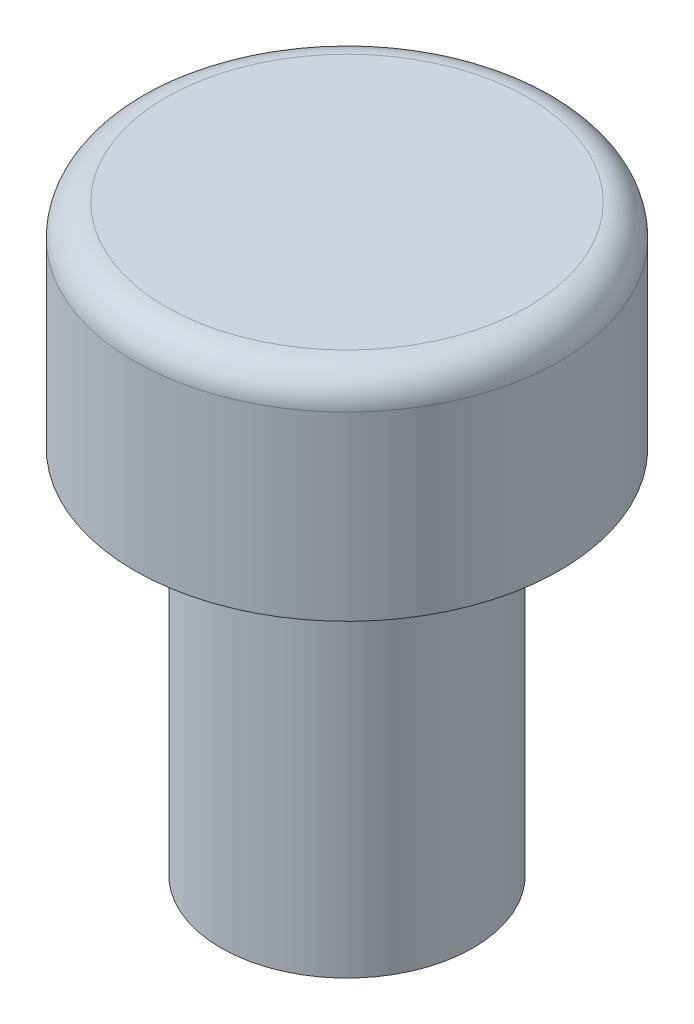
ISO-10303-21;
HEADER;
FILE_DESCRIPTION(('STEP AP214'),'2;1');
FILE_NAME('part.step','',(''),(''),'','','');
FILE_SCHEMA(('AUTOMOTIVE_DESIGN { 1 0 10303 214 1 1 1 1 }'));
ENDSEC;
DATA;
#1=APPLICATION_CONTEXT('core data for automotive mechanical design processes');
#2=APPLICATION_PROTOCOL_DEFINITION('international standard','automotive_design',2000,#1);
#3=PRODUCT_CONTEXT('',#1,'mechanical');
#4=PRODUCT('Part','Part','',(#3));
#5=PRODUCT_RELATED_PRODUCT_CATEGORY('part','',(#4));
#6=PRODUCT_DEFINITION_FORMATION('','',#4);
#7=PRODUCT_DEFINITION_CONTEXT('part definition',#1,'design');
#8=PRODUCT_DEFINITION('design','',#6,#7);
#9=PRODUCT_DEFINITION_SHAPE('','',#8);
#10=(LENGTH_UNIT() NAMED_UNIT(*) SI_UNIT(.MILLI.,.METRE.));
#11=(NAMED_UNIT(*) PLANE_ANGLE_UNIT() SI_UNIT($,.RADIAN.));
#12=(NAMED_UNIT(*) SI_UNIT($,.STERADIAN.) SOLID_ANGLE_UNIT());
#13=UNCERTAINTY_MEASURE_WITH_UNIT(LENGTH_MEASURE(1.E-05),#10,'distance_accuracy_value','');
#14=(GEOMETRIC_REPRESENTATION_CONTEXT(3) GLOBAL_UNCERTAINTY_ASSIGNED_CONTEXT((#13)) GLOBAL_UNIT_ASSIGNED_CONTEXT((#10,
#11,#12)) REPRESENTATION_CONTEXT('',''));
#15=CARTESIAN_POINT('',(0.,0.,0.));
#16=DIRECTION('',(0.,0.,1.));
#17=DIRECTION('',(1.,0.,0.));
#18=AXIS2_PLACEMENT_3D('',#15,#16,#17);
#19=CARTESIAN_POINT('',(8.,0.,0.));
#20=DIRECTION('',(0.,-1.,0.));
#21=DIRECTION('',(0.,0.,-1.));
#22=AXIS2_PLACEMENT_3D('',#19,#20,#21);
#23=PLANE('',#22);
#24=CARTESIAN_POINT('',(0.,0.,0.));
#25=DIRECTION('',(0.,-1.,0.));
#26=DIRECTION('',(0.,0.,-1.));
#27=AXIS2_PLACEMENT_3D('',#24,#25,#26);
#28=CIRCLE('',#27,8.);
#29=CARTESIAN_POINT('',(0.,0.,-8.));
#30=VERTEX_POINT('',#29);
#31=EDGE_CURVE('E67',#30,#30,#28,.T.);
#32=ORIENTED_EDGE('',*,*,#31,.T.);
#33=EDGE_LOOP('',(#32));
#34=FACE_BOUND('',#33,.T.);
#35=ADVANCED_FACE('F43',(#34),#23,.T.);
#36=CARTESIAN_POINT('',(0.,37.,0.));
#37=DIRECTION('',(0.,1.,0.));
#38=DIRECTION('',(0.,0.,1.));
#39=AXIS2_PLACEMENT_3D('',#36,#37,#38);
#40=PLANE('',#39);
#41=CARTESIAN_POINT('',(0.,37.,0.));
#42=DIRECTION('',(0.,1.,0.));
#43=DIRECTION('',(0.,0.,1.));
#44=AXIS2_PLACEMENT_3D('',#41,#42,#43);
#45=CIRCLE('',#44,11.5);
#46=CARTESIAN_POINT('',(0.,37.,11.5));
#47=VERTEX_POINT('',#46);
#48=EDGE_CURVE('E10',#47,#47,#45,.T.);
#49=ORIENTED_EDGE('',*,*,#48,.T.);
#50=EDGE_LOOP('',(#49));
#51=FACE_BOUND('',#50,.T.);
#52=ADVANCED_FACE('F87',(#51),#40,.T.);
#53=CARTESIAN_POINT('',(0.,0.,0.));
#54=DIRECTION('',(0.,-1.,0.));
#55=DIRECTION('',(0.,0.,-1.));
#56=AXIS2_PLACEMENT_3D('',#53,#54,#55);
#57=CYLINDRICAL_SURFACE('',#56,13.5);
#58=CARTESIAN_POINT('',(0.,35.,0.));
#59=DIRECTION('',(0.,1.,0.));
#60=DIRECTION('',(0.,0.,1.));
#61=AXIS2_PLACEMENT_3D('',#58,#59,#60);
#62=CIRCLE('',#61,13.5);
#63=CARTESIAN_POINT('',(0.,35.,13.5));
#64=VERTEX_POINT('',#63);
#65=EDGE_CURVE('E51',#64,#64,#62,.F.);
#66=ORIENTED_EDGE('',*,*,#65,.T.);
#67=EDGE_LOOP('',(#66));
#68=FACE_BOUND('',#67,.T.);
#69=CARTESIAN_POINT('',(0.,23.5,0.));
#70=DIRECTION('',(0.,-1.,0.));
#71=DIRECTION('',(0.,0.,-1.));
#72=AXIS2_PLACEMENT_3D('',#69,#70,#71);
#73=CIRCLE('',#72,13.5);
#74=CARTESIAN_POINT('',(0.,23.5,-13.5));
#75=VERTEX_POINT('',#74);
#76=EDGE_CURVE('E56',#75,#75,#73,.T.);
#77=ORIENTED_EDGE('',*,*,#76,.F.);
#78=EDGE_LOOP('',(#77));
#79=FACE_BOUND('',#78,.T.);
#80=ADVANCED_FACE('F83',(#68,#79),#57,.T.);
#81=CARTESIAN_POINT('',(13.5,23.5,0.));
#82=DIRECTION('',(0.,-1.,0.));
#83=DIRECTION('',(0.,0.,-1.));
#84=AXIS2_PLACEMENT_3D('',#81,#82,#83);
#85=PLANE('',#84);
#86=ORIENTED_EDGE('',*,*,#76,.T.);
#87=EDGE_LOOP('',(#86));
#88=FACE_BOUND('',#87,.T.);
#89=CARTESIAN_POINT('',(0.,23.5,0.));
#90=DIRECTION('',(0.,-1.,0.));
#91=DIRECTION('',(0.,0.,-1.));
#92=AXIS2_PLACEMENT_3D('',#89,#90,#91);
#93=CIRCLE('',#92,8.);
#94=CARTESIAN_POINT('',(0.,23.5,-8.));
#95=VERTEX_POINT('',#94);
#96=EDGE_CURVE('E61',#95,#95,#93,.T.);
#97=ORIENTED_EDGE('',*,*,#96,.F.);
#98=EDGE_LOOP('',(#97));
#99=FACE_BOUND('',#98,.T.);
#100=ADVANCED_FACE('F75',(#88,#99),#85,.T.);
#101=CARTESIAN_POINT('',(0.,0.,0.));
#102=DIRECTION('',(0.,-1.,0.));
#103=DIRECTION('',(0.,0.,-1.));
#104=AXIS2_PLACEMENT_3D('',#101,#102,#103);
#105=CYLINDRICAL_SURFACE('',#104,8.);
#106=ORIENTED_EDGE('',*,*,#96,.T.);
#107=EDGE_LOOP('',(#106));
#108=FACE_BOUND('',#107,.T.);
#109=ORIENTED_EDGE('',*,*,#31,.F.);
#110=EDGE_LOOP('',(#109));
#111=FACE_BOUND('',#110,.T.);
#112=ADVANCED_FACE('F73',(#108,#111),#105,.T.);
#113=CARTESIAN_POINT('',(0.,35.,0.));
#114=DIRECTION('',(0.,1.,0.));
#115=DIRECTION('',(0.,0.,1.));
#116=AXIS2_PLACEMENT_3D('',#113,#114,#115);
#117=TOROIDAL_SURFACE('',#116,11.5,2.);
#118=ORIENTED_EDGE('',*,*,#48,.F.);
#119=EDGE_LOOP('',(#118));
#120=FACE_BOUND('',#119,.T.);
#121=ORIENTED_EDGE('',*,*,#65,.F.);
#122=EDGE_LOOP('',(#121));
#123=FACE_BOUND('',#122,.T.);
#124=ADVANCED_FACE('F45',(#120,#123),#117,.T.);
#125=CLOSED_SHELL('',(#35,#52,#80,#100,#112,#124));
#126=MANIFOLD_SOLID_BREP('B2',#125);
#127=ADVANCED_BREP_SHAPE_REPRESENTATION('',(#18,#126),#14);
#128=SHAPE_DEFINITION_REPRESENTATION(#9,#127);
ENDSEC;
END-ISO-10303-21;
